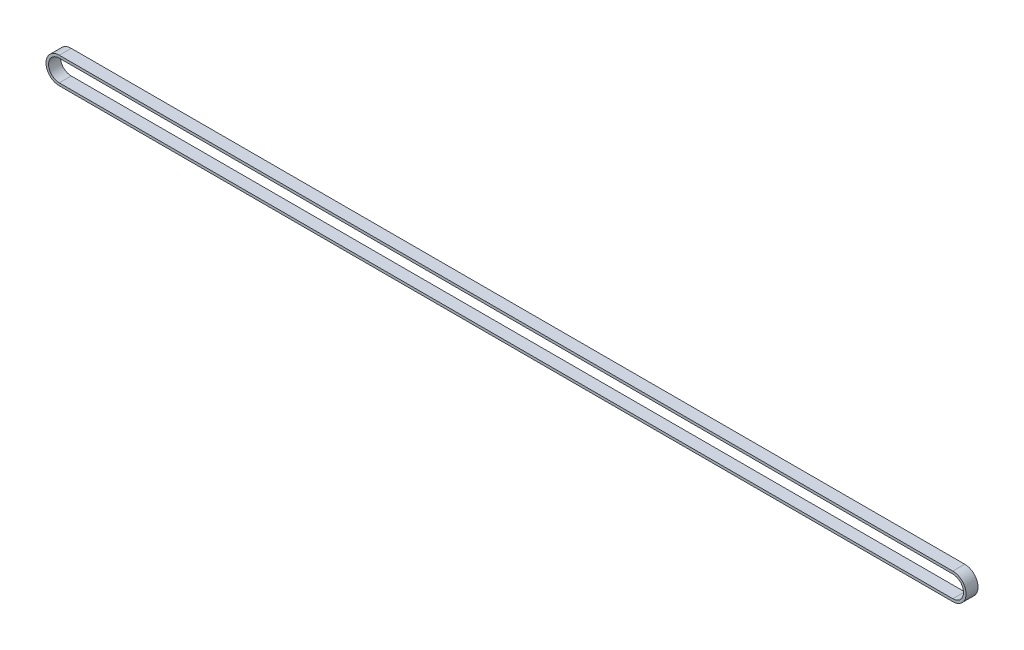
ISO-10303-21;
HEADER;
FILE_DESCRIPTION(('STEP AP214'),'2;1');
FILE_NAME('part.step','',(''),(''),'','','');
FILE_SCHEMA(('AUTOMOTIVE_DESIGN { 1 0 10303 214 1 1 1 1 }'));
ENDSEC;
DATA;
#1=APPLICATION_CONTEXT('core data for automotive mechanical design processes');
#2=APPLICATION_PROTOCOL_DEFINITION('international standard','automotive_design',2000,#1);
#3=PRODUCT_CONTEXT('',#1,'mechanical');
#4=PRODUCT('Part','Part','',(#3));
#5=PRODUCT_RELATED_PRODUCT_CATEGORY('part','',(#4));
#6=PRODUCT_DEFINITION_FORMATION('','',#4);
#7=PRODUCT_DEFINITION_CONTEXT('part definition',#1,'design');
#8=PRODUCT_DEFINITION('design','',#6,#7);
#9=PRODUCT_DEFINITION_SHAPE('','',#8);
#10=(LENGTH_UNIT() NAMED_UNIT(*) SI_UNIT(.MILLI.,.METRE.));
#11=(NAMED_UNIT(*) PLANE_ANGLE_UNIT() SI_UNIT($,.RADIAN.));
#12=(NAMED_UNIT(*) SI_UNIT($,.STERADIAN.) SOLID_ANGLE_UNIT());
#13=UNCERTAINTY_MEASURE_WITH_UNIT(LENGTH_MEASURE(1.E-05),#10,'distance_accuracy_value','');
#14=(GEOMETRIC_REPRESENTATION_CONTEXT(3) GLOBAL_UNCERTAINTY_ASSIGNED_CONTEXT((#13)) GLOBAL_UNIT_ASSIGNED_CONTEXT((#10,
#11,#12)) REPRESENTATION_CONTEXT('',''));
#15=CARTESIAN_POINT('',(0.,0.,0.));
#16=DIRECTION('',(0.,0.,1.));
#17=DIRECTION('',(1.,0.,0.));
#18=AXIS2_PLACEMENT_3D('',#15,#16,#17);
#19=CARTESIAN_POINT('',(131.506877487448,-26.0544527980421,767.621746409681));
#20=DIRECTION('',(0.,0.,1.));
#21=DIRECTION('',(1.,0.,0.));
#22=AXIS2_PLACEMENT_3D('',#19,#20,#21);
#23=CYLINDRICAL_SURFACE('',#22,5.54736842105235);
#24=CARTESIAN_POINT('',(131.506877487448,-26.0544527980421,772.621746409681));
#25=DIRECTION('',(0.,0.,1.));
#26=DIRECTION('',(1.,0.,0.));
#27=AXIS2_PLACEMENT_3D('',#24,#25,#26);
#28=CIRCLE('',#27,5.54736842105235);
#29=CARTESIAN_POINT('',(131.506877487448,-20.5070843769901,772.621746409681));
#30=VERTEX_POINT('',#29);
#31=CARTESIAN_POINT('',(131.506877487448,-31.6018212190948,772.621746409681));
#32=VERTEX_POINT('',#31);
#33=EDGE_CURVE('E130',#30,#32,#28,.T.);
#34=ORIENTED_EDGE('',*,*,#33,.F.);
#35=DIRECTION('',(0.,0.,1.));
#36=VECTOR('',#35,1.);
#37=CARTESIAN_POINT('',(131.506877487448,-20.5070843769901,767.621746409681));
#38=LINE('',#37,#36);
#39=CARTESIAN_POINT('',(131.506877487448,-20.5070843769901,767.621746409681));
#40=VERTEX_POINT('',#39);
#41=EDGE_CURVE('E11',#40,#30,#38,.T.);
#42=ORIENTED_EDGE('',*,*,#41,.F.);
#43=CARTESIAN_POINT('',(131.506877487448,-26.0544527980421,767.621746409681));
#44=DIRECTION('',(0.,0.,1.));
#45=DIRECTION('',(1.,0.,0.));
#46=AXIS2_PLACEMENT_3D('',#43,#44,#45);
#47=CIRCLE('',#46,5.54736842105235);
#48=CARTESIAN_POINT('',(131.506877487448,-31.6018212190948,767.621746409681));
#49=VERTEX_POINT('',#48);
#50=EDGE_CURVE('E134',#40,#49,#47,.T.);
#51=ORIENTED_EDGE('',*,*,#50,.T.);
#52=DIRECTION('',(0.,0.,1.));
#53=VECTOR('',#52,1.);
#54=CARTESIAN_POINT('',(131.506877487448,-31.6018212190948,767.621746409681));
#55=LINE('',#54,#53);
#56=EDGE_CURVE('E35',#49,#32,#55,.T.);
#57=ORIENTED_EDGE('',*,*,#56,.T.);
#58=EDGE_LOOP('',(#34,#42,#51,#57));
#59=FACE_BOUND('',#58,.T.);
#60=ADVANCED_FACE('F32',(#59),#23,.T.);
#61=CARTESIAN_POINT('',(505.506877487448,-20.5070843769908,767.621746409681));
#62=DIRECTION('',(0.,1.,0.));
#63=DIRECTION('',(-1.,0.,0.));
#64=AXIS2_PLACEMENT_3D('',#61,#62,#63);
#65=PLANE('',#64);
#66=DIRECTION('',(-1.,0.,0.));
#67=VECTOR('',#66,1.);
#68=CARTESIAN_POINT('',(505.506877487448,-20.5070843769908,772.621746409681));
#69=LINE('',#68,#67);
#70=CARTESIAN_POINT('',(505.506877487448,-20.5070843769908,772.621746409681));
#71=VERTEX_POINT('',#70);
#72=EDGE_CURVE('E138',#71,#30,#69,.T.);
#73=ORIENTED_EDGE('',*,*,#72,.F.);
#74=DIRECTION('',(0.,0.,1.));
#75=VECTOR('',#74,1.);
#76=CARTESIAN_POINT('',(505.506877487448,-20.5070843769908,767.621746409681));
#77=LINE('',#76,#75);
#78=CARTESIAN_POINT('',(505.506877487448,-20.5070843769908,767.621746409681));
#79=VERTEX_POINT('',#78);
#80=EDGE_CURVE('E40',#79,#71,#77,.T.);
#81=ORIENTED_EDGE('',*,*,#80,.F.);
#82=DIRECTION('',(-1.,0.,0.));
#83=VECTOR('',#82,1.);
#84=CARTESIAN_POINT('',(505.506877487448,-20.5070843769908,767.621746409681));
#85=LINE('',#84,#83);
#86=EDGE_CURVE('E144',#79,#40,#85,.T.);
#87=ORIENTED_EDGE('',*,*,#86,.T.);
#88=ORIENTED_EDGE('',*,*,#41,.T.);
#89=EDGE_LOOP('',(#73,#81,#87,#88));
#90=FACE_BOUND('',#89,.T.);
#91=ADVANCED_FACE('F170',(#90),#65,.T.);
#92=CARTESIAN_POINT('',(505.506877487448,-26.0544527980434,767.621746409681));
#93=DIRECTION('',(0.,0.,1.));
#94=DIRECTION('',(1.,0.,0.));
#95=AXIS2_PLACEMENT_3D('',#92,#93,#94);
#96=CYLINDRICAL_SURFACE('',#95,5.54736842105262);
#97=CARTESIAN_POINT('',(505.506877487448,-26.0544527980434,772.621746409681));
#98=DIRECTION('',(0.,0.,1.));
#99=DIRECTION('',(1.,0.,0.));
#100=AXIS2_PLACEMENT_3D('',#97,#98,#99);
#101=CIRCLE('',#100,5.54736842105262);
#102=CARTESIAN_POINT('',(505.506877487448,-31.601821219096,772.621746409681));
#103=VERTEX_POINT('',#102);
#104=EDGE_CURVE('E152',#103,#71,#101,.T.);
#105=ORIENTED_EDGE('',*,*,#104,.F.);
#106=DIRECTION('',(0.,0.,1.));
#107=VECTOR('',#106,1.);
#108=CARTESIAN_POINT('',(505.506877487448,-31.601821219096,767.621746409681));
#109=LINE('',#108,#107);
#110=CARTESIAN_POINT('',(505.506877487448,-31.601821219096,767.621746409681));
#111=VERTEX_POINT('',#110);
#112=EDGE_CURVE('E157',#111,#103,#109,.T.);
#113=ORIENTED_EDGE('',*,*,#112,.F.);
#114=CARTESIAN_POINT('',(505.506877487448,-26.0544527980434,767.621746409681));
#115=DIRECTION('',(0.,0.,1.));
#116=DIRECTION('',(1.,0.,0.));
#117=AXIS2_PLACEMENT_3D('',#114,#115,#116);
#118=CIRCLE('',#117,5.54736842105262);
#119=EDGE_CURVE('E141',#111,#79,#118,.T.);
#120=ORIENTED_EDGE('',*,*,#119,.T.);
#121=ORIENTED_EDGE('',*,*,#80,.T.);
#122=EDGE_LOOP('',(#105,#113,#120,#121));
#123=FACE_BOUND('',#122,.T.);
#124=ADVANCED_FACE('F174',(#123),#96,.T.);
#125=CARTESIAN_POINT('',(131.506877487448,-31.6018212190948,767.621746409681));
#126=DIRECTION('',(0.,-1.,0.));
#127=DIRECTION('',(1.,0.,0.));
#128=AXIS2_PLACEMENT_3D('',#125,#126,#127);
#129=PLANE('',#128);
#130=DIRECTION('',(1.,0.,0.));
#131=VECTOR('',#130,1.);
#132=CARTESIAN_POINT('',(131.506877487448,-31.6018212190948,772.621746409681));
#133=LINE('',#132,#131);
#134=EDGE_CURVE('E149',#32,#103,#133,.T.);
#135=ORIENTED_EDGE('',*,*,#134,.F.);
#136=ORIENTED_EDGE('',*,*,#56,.F.);
#137=DIRECTION('',(1.,0.,0.));
#138=VECTOR('',#137,1.);
#139=CARTESIAN_POINT('',(131.506877487448,-31.6018212190948,767.621746409681));
#140=LINE('',#139,#138);
#141=EDGE_CURVE('E137',#49,#111,#140,.T.);
#142=ORIENTED_EDGE('',*,*,#141,.T.);
#143=ORIENTED_EDGE('',*,*,#112,.T.);
#144=EDGE_LOOP('',(#135,#136,#142,#143));
#145=FACE_BOUND('',#144,.T.);
#146=ADVANCED_FACE('F165',(#145),#129,.T.);
#147=CARTESIAN_POINT('',(131.506877487448,-26.0544527980421,767.621746409681));
#148=DIRECTION('',(0.,0.,1.));
#149=DIRECTION('',(1.,0.,0.));
#150=AXIS2_PLACEMENT_3D('',#147,#148,#149);
#151=PLANE('',#150);
#152=DIRECTION('',(1.,0.,0.));
#153=VECTOR('',#152,1.);
#154=CARTESIAN_POINT('',(505.506877487448,-30.5281370085697,767.621746409681));
#155=LINE('',#154,#153);
#156=CARTESIAN_POINT('',(131.506877487448,-30.528137008569,767.621746409681));
#157=VERTEX_POINT('',#156);
#158=CARTESIAN_POINT('',(505.506877487448,-30.5281370085697,767.621746409681));
#159=VERTEX_POINT('',#158);
#160=EDGE_CURVE('E105',#157,#159,#155,.T.);
#161=ORIENTED_EDGE('',*,*,#160,.T.);
#162=CARTESIAN_POINT('',(505.506877487448,-26.0544527980434,767.621746409681));
#163=DIRECTION('',(0.,0.,1.));
#164=DIRECTION('',(-1.,0.,0.));
#165=AXIS2_PLACEMENT_3D('',#162,#163,#164);
#166=CIRCLE('',#165,4.47368421052661);
#167=CARTESIAN_POINT('',(505.506877487448,-21.5807685875164,767.621746409681));
#168=VERTEX_POINT('',#167);
#169=EDGE_CURVE('E99',#159,#168,#166,.T.);
#170=ORIENTED_EDGE('',*,*,#169,.T.);
#171=DIRECTION('',(-1.,0.,0.));
#172=VECTOR('',#171,1.);
#173=CARTESIAN_POINT('',(131.506877487448,-21.5807685875158,767.621746409681));
#174=LINE('',#173,#172);
#175=CARTESIAN_POINT('',(131.506877487448,-21.5807685875158,767.621746409681));
#176=VERTEX_POINT('',#175);
#177=EDGE_CURVE('E108',#168,#176,#174,.T.);
#178=ORIENTED_EDGE('',*,*,#177,.T.);
#179=CARTESIAN_POINT('',(131.506877487448,-26.0544527980421,767.621746409681));
#180=DIRECTION('',(0.,0.,1.));
#181=DIRECTION('',(-1.,0.,0.));
#182=AXIS2_PLACEMENT_3D('',#179,#180,#181);
#183=CIRCLE('',#182,4.47368421052661);
#184=EDGE_CURVE('E48',#176,#157,#183,.T.);
#185=ORIENTED_EDGE('',*,*,#184,.T.);
#186=EDGE_LOOP('',(#161,#170,#178,#185));
#187=FACE_BOUND('',#186,.T.);
#188=ORIENTED_EDGE('',*,*,#50,.F.);
#189=ORIENTED_EDGE('',*,*,#86,.F.);
#190=ORIENTED_EDGE('',*,*,#119,.F.);
#191=ORIENTED_EDGE('',*,*,#141,.F.);
#192=EDGE_LOOP('',(#188,#189,#190,#191));
#193=FACE_BOUND('',#192,.T.);
#194=ADVANCED_FACE('F112',(#187,#193),#151,.F.);
#195=CARTESIAN_POINT('',(131.506877487448,-26.0544527980421,772.621746409681));
#196=DIRECTION('',(0.,0.,1.));
#197=DIRECTION('',(1.,0.,0.));
#198=AXIS2_PLACEMENT_3D('',#195,#196,#197);
#199=PLANE('',#198);
#200=CARTESIAN_POINT('',(505.506877487448,-26.0544527980434,772.621746409681));
#201=DIRECTION('',(0.,0.,1.));
#202=DIRECTION('',(-1.,0.,0.));
#203=AXIS2_PLACEMENT_3D('',#200,#201,#202);
#204=CIRCLE('',#203,4.47368421052661);
#205=CARTESIAN_POINT('',(505.506877487448,-30.5281370085697,772.621746409681));
#206=VERTEX_POINT('',#205);
#207=CARTESIAN_POINT('',(505.506877487448,-21.5807685875164,772.621746409681));
#208=VERTEX_POINT('',#207);
#209=EDGE_CURVE('E56',#206,#208,#204,.T.);
#210=ORIENTED_EDGE('',*,*,#209,.F.);
#211=DIRECTION('',(1.,0.,0.));
#212=VECTOR('',#211,1.);
#213=CARTESIAN_POINT('',(505.506877487448,-30.5281370085697,772.621746409681));
#214=LINE('',#213,#212);
#215=CARTESIAN_POINT('',(131.506877487448,-30.528137008569,772.621746409681));
#216=VERTEX_POINT('',#215);
#217=EDGE_CURVE('E115',#216,#206,#214,.T.);
#218=ORIENTED_EDGE('',*,*,#217,.F.);
#219=CARTESIAN_POINT('',(131.506877487448,-26.0544527980421,772.621746409681));
#220=DIRECTION('',(0.,0.,1.));
#221=DIRECTION('',(-1.,0.,0.));
#222=AXIS2_PLACEMENT_3D('',#219,#220,#221);
#223=CIRCLE('',#222,4.47368421052661);
#224=CARTESIAN_POINT('',(131.506877487448,-21.5807685875155,772.621746409681));
#225=VERTEX_POINT('',#224);
#226=EDGE_CURVE('E118',#225,#216,#223,.T.);
#227=ORIENTED_EDGE('',*,*,#226,.F.);
#228=DIRECTION('',(-1.,0.,0.));
#229=VECTOR('',#228,1.);
#230=CARTESIAN_POINT('',(131.506877487448,-21.5807685875158,772.621746409681));
#231=LINE('',#230,#229);
#232=EDGE_CURVE('E124',#208,#225,#231,.T.);
#233=ORIENTED_EDGE('',*,*,#232,.F.);
#234=EDGE_LOOP('',(#210,#218,#227,#233));
#235=FACE_BOUND('',#234,.T.);
#236=ORIENTED_EDGE('',*,*,#33,.T.);
#237=ORIENTED_EDGE('',*,*,#134,.T.);
#238=ORIENTED_EDGE('',*,*,#104,.T.);
#239=ORIENTED_EDGE('',*,*,#72,.T.);
#240=EDGE_LOOP('',(#236,#237,#238,#239));
#241=FACE_BOUND('',#240,.T.);
#242=ADVANCED_FACE('F167',(#235,#241),#199,.T.);
#243=CARTESIAN_POINT('',(505.506877487448,-26.0544527980434,767.621746409681));
#244=DIRECTION('',(0.,0.,1.));
#245=DIRECTION('',(1.,0.,0.));
#246=AXIS2_PLACEMENT_3D('',#243,#244,#245);
#247=CYLINDRICAL_SURFACE('',#246,4.47368421052661);
#248=ORIENTED_EDGE('',*,*,#209,.T.);
#249=DIRECTION('',(0.,0.,1.));
#250=VECTOR('',#249,1.);
#251=CARTESIAN_POINT('',(505.506877487448,-21.5807685875164,767.621746409681));
#252=LINE('',#251,#250);
#253=EDGE_CURVE('E95',#168,#208,#252,.T.);
#254=ORIENTED_EDGE('',*,*,#253,.F.);
#255=ORIENTED_EDGE('',*,*,#169,.F.);
#256=DIRECTION('',(0.,0.,1.));
#257=VECTOR('',#256,1.);
#258=CARTESIAN_POINT('',(505.506877487448,-30.5281370085697,767.621746409681));
#259=LINE('',#258,#257);
#260=EDGE_CURVE('E128',#159,#206,#259,.T.);
#261=ORIENTED_EDGE('',*,*,#260,.T.);
#262=EDGE_LOOP('',(#248,#254,#255,#261));
#263=FACE_BOUND('',#262,.T.);
#264=ADVANCED_FACE('F97',(#263),#247,.F.);
#265=CARTESIAN_POINT('',(505.506877487448,-30.5281370085697,767.621746409681));
#266=DIRECTION('',(0.,-1.,0.));
#267=DIRECTION('',(1.,0.,0.));
#268=AXIS2_PLACEMENT_3D('',#265,#266,#267);
#269=PLANE('',#268);
#270=ORIENTED_EDGE('',*,*,#217,.T.);
#271=ORIENTED_EDGE('',*,*,#260,.F.);
#272=ORIENTED_EDGE('',*,*,#160,.F.);
#273=DIRECTION('',(0.,0.,1.));
#274=VECTOR('',#273,1.);
#275=CARTESIAN_POINT('',(131.506877487448,-30.528137008569,767.621746409681));
#276=LINE('',#275,#274);
#277=EDGE_CURVE('E131',#157,#216,#276,.T.);
#278=ORIENTED_EDGE('',*,*,#277,.T.);
#279=EDGE_LOOP('',(#270,#271,#272,#278));
#280=FACE_BOUND('',#279,.T.);
#281=ADVANCED_FACE('F225',(#280),#269,.F.);
#282=CARTESIAN_POINT('',(131.506877487448,-26.0544527980421,767.621746409681));
#283=DIRECTION('',(0.,0.,1.));
#284=DIRECTION('',(1.,0.,0.));
#285=AXIS2_PLACEMENT_3D('',#282,#283,#284);
#286=CYLINDRICAL_SURFACE('',#285,4.47368421052661);
#287=ORIENTED_EDGE('',*,*,#226,.T.);
#288=ORIENTED_EDGE('',*,*,#277,.F.);
#289=ORIENTED_EDGE('',*,*,#184,.F.);
#290=DIRECTION('',(0.,0.,1.));
#291=VECTOR('',#290,1.);
#292=CARTESIAN_POINT('',(131.506877487448,-21.5807685875155,767.621746409681));
#293=LINE('',#292,#291);
#294=EDGE_CURVE('E104',#176,#225,#293,.T.);
#295=ORIENTED_EDGE('',*,*,#294,.T.);
#296=EDGE_LOOP('',(#287,#288,#289,#295));
#297=FACE_BOUND('',#296,.T.);
#298=ADVANCED_FACE('F234',(#297),#286,.F.);
#299=CARTESIAN_POINT('',(131.506877487448,-21.5807685875158,767.621746409681));
#300=DIRECTION('',(0.,1.,0.));
#301=DIRECTION('',(-1.,0.,0.));
#302=AXIS2_PLACEMENT_3D('',#299,#300,#301);
#303=PLANE('',#302);
#304=ORIENTED_EDGE('',*,*,#232,.T.);
#305=ORIENTED_EDGE('',*,*,#294,.F.);
#306=ORIENTED_EDGE('',*,*,#177,.F.);
#307=ORIENTED_EDGE('',*,*,#253,.T.);
#308=EDGE_LOOP('',(#304,#305,#306,#307));
#309=FACE_BOUND('',#308,.T.);
#310=ADVANCED_FACE('F109',(#309),#303,.F.);
#311=CLOSED_SHELL('',(#60,#91,#124,#146,#194,#242,#264,#281,#298,#310));
#312=MANIFOLD_SOLID_BREP('B2',#311);
#313=ADVANCED_BREP_SHAPE_REPRESENTATION('',(#18,#312),#14);
#314=SHAPE_DEFINITION_REPRESENTATION(#9,#313);
ENDSEC;
END-ISO-10303-21;
